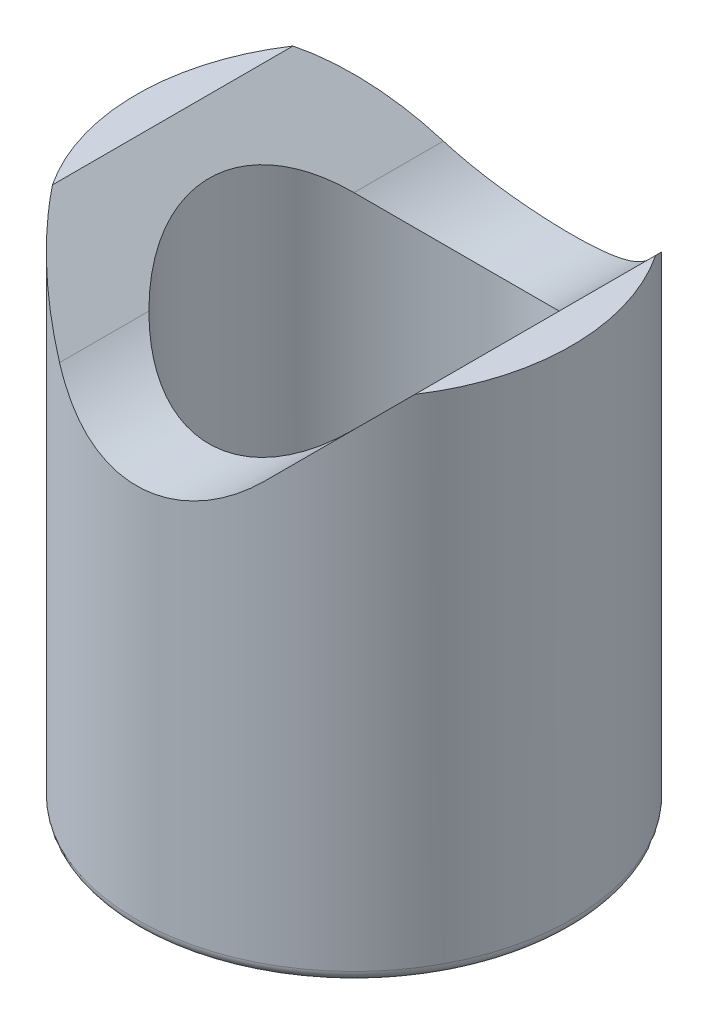
ISO-10303-21;
HEADER;
FILE_DESCRIPTION(('STEP AP214'),'2;1');
FILE_NAME('part.step','',(''),(''),'','','');
FILE_SCHEMA(('AUTOMOTIVE_DESIGN { 1 0 10303 214 1 1 1 1 }'));
ENDSEC;
DATA;
#1=APPLICATION_CONTEXT('core data for automotive mechanical design processes');
#2=APPLICATION_PROTOCOL_DEFINITION('international standard','automotive_design',2000,#1);
#3=PRODUCT_CONTEXT('',#1,'mechanical');
#4=PRODUCT('Part','Part','',(#3));
#5=PRODUCT_RELATED_PRODUCT_CATEGORY('part','',(#4));
#6=PRODUCT_DEFINITION_FORMATION('','',#4);
#7=PRODUCT_DEFINITION_CONTEXT('part definition',#1,'design');
#8=PRODUCT_DEFINITION('design','',#6,#7);
#9=PRODUCT_DEFINITION_SHAPE('','',#8);
#10=(LENGTH_UNIT() NAMED_UNIT(*) SI_UNIT(.MILLI.,.METRE.));
#11=(NAMED_UNIT(*) PLANE_ANGLE_UNIT() SI_UNIT($,.RADIAN.));
#12=(NAMED_UNIT(*) SI_UNIT($,.STERADIAN.) SOLID_ANGLE_UNIT());
#13=UNCERTAINTY_MEASURE_WITH_UNIT(LENGTH_MEASURE(1.E-05),#10,'distance_accuracy_value','');
#14=(GEOMETRIC_REPRESENTATION_CONTEXT(3) GLOBAL_UNCERTAINTY_ASSIGNED_CONTEXT((#13)) GLOBAL_UNIT_ASSIGNED_CONTEXT((#10,
#11,#12)) REPRESENTATION_CONTEXT('',''));
#15=CARTESIAN_POINT('',(0.,0.,0.));
#16=DIRECTION('',(0.,0.,1.));
#17=DIRECTION('',(1.,0.,0.));
#18=AXIS2_PLACEMENT_3D('',#15,#16,#17);
#19=CARTESIAN_POINT('',(0.,15.,0.));
#20=DIRECTION('',(0.,-1.,0.));
#21=DIRECTION('',(0.,0.,-1.));
#22=AXIS2_PLACEMENT_3D('',#19,#20,#21);
#23=CYLINDRICAL_SURFACE('',#22,6.);
#24=CARTESIAN_POINT('',(0.,0.3,0.));
#25=DIRECTION('',(0.,1.,0.));
#26=DIRECTION('',(0.,0.,1.));
#27=AXIS2_PLACEMENT_3D('',#24,#25,#26);
#28=CIRCLE('',#27,6.);
#29=CARTESIAN_POINT('',(0.,0.3,6.));
#30=VERTEX_POINT('',#29);
#31=EDGE_CURVE('E44',#30,#30,#28,.T.);
#32=ORIENTED_EDGE('',*,*,#31,.T.);
#33=EDGE_LOOP('',(#32));
#34=FACE_BOUND('',#33,.T.);
#35=CARTESIAN_POINT('',(-2.82842712474622,11.8284271247462,-5.29150262212917));
#36=CARTESIAN_POINT('',(-2.75297025166694,11.7529771607806,-5.33184478983745));
#37=CARTESIAN_POINT('',(-2.67437380901403,11.6804132231097,-5.37177250970208));
#38=CARTESIAN_POINT('',(-2.51108217079393,11.5414116339634,-5.45001321405304));
#39=CARTESIAN_POINT('',(-2.42638262276536,11.474978433221,-5.48832501464365));
#40=CARTESIAN_POINT('',(-2.25051268528001,11.3482253965884,-5.56276773112512));
#41=CARTESIAN_POINT('',(-2.15929824169915,11.287955540965,-5.59887998292586));
#42=CARTESIAN_POINT('',(-1.97132395544556,11.1746245644371,-5.66779478233693));
#43=CARTESIAN_POINT('',(-1.87456522898201,11.1215619997163,-5.70059799249845));
#44=CARTESIAN_POINT('',(-1.67540977182413,11.0229291219893,-5.76228461922013));
#45=CARTESIAN_POINT('',(-1.572986232299,10.9773993904355,-5.79114666683474));
#46=CARTESIAN_POINT('',(-1.36358431649906,10.8947667003439,-5.8439963668176));
#47=CARTESIAN_POINT('',(-1.25660657912207,10.8576625643945,-5.86798470020012));
#48=CARTESIAN_POINT('',(-1.03923835932492,10.7925548124275,-5.91034693775319));
#49=CARTESIAN_POINT('',(-0.928860822696962,10.7645204576365,-5.92873979287044));
#50=CARTESIAN_POINT('',(-0.705309652051151,10.7178735372847,-5.95946809822953));
#51=CARTESIAN_POINT('',(-0.592136502227185,10.6992593520064,-5.9718045898003));
#52=CARTESIAN_POINT('',(-0.377698754130678,10.6734412860512,-5.98894805720612));
#53=CARTESIAN_POINT('',(-0.276622254512563,10.665141982266,-5.9944771329993));
#54=CARTESIAN_POINT('',(-0.0739855225647571,10.6562530727374,-6.00039986457335));
#55=CARTESIAN_POINT('',(0.0275746668704457,10.655662795626,-6.00079396755165));
#56=CARTESIAN_POINT('',(0.230379438819053,10.6622055550273,-5.99643319864387));
#57=CARTESIAN_POINT('',(0.331623878331088,10.6693416908625,-5.99167626050293));
#58=CARTESIAN_POINT('',(0.53289530451549,10.6912160751192,-5.97714183409941));
#59=CARTESIAN_POINT('',(0.632922314466163,10.70595417795,-5.96736444198712));
#60=CARTESIAN_POINT('',(0.91550946141661,10.758572343094,-5.93261396747677));
#61=CARTESIAN_POINT('',(1.09577098016184,10.8054707536942,-5.90179171896145));
#62=CARTESIAN_POINT('',(1.44532927506301,10.9225400459782,-5.8260729460599));
#63=CARTESIAN_POINT('',(1.61462080967149,10.9927219561173,-5.78116975265079));
#64=CARTESIAN_POINT('',(1.95305769285139,11.1605465664463,-5.67622399763744));
#65=CARTESIAN_POINT('',(2.12100557341202,11.2599956362366,-5.615229055356));
#66=CARTESIAN_POINT('',(2.43837241570419,11.4801238621583,-5.48486429510174));
#67=CARTESIAN_POINT('',(2.58781289813621,11.6007779580135,-5.41550439293835));
#68=CARTESIAN_POINT('',(2.76162294790297,11.7627851431444,-5.32681312932454));
#69=CARTESIAN_POINT('',(2.79533156819427,11.7953321754941,-5.30919524361678));
#70=CARTESIAN_POINT('',(2.82842712474621,11.8284271247462,-5.29150262212917));
#71=B_SPLINE_CURVE_WITH_KNOTS('',3,(#35,#36,#37,#38,#39,#40,#41,#42,#43,#44,#45,#46,#47,#48,#49,
#50,#51,#52,#53,#54,#55,#56,#57,#58,#59,#60,#61,#62,#63,#64,#65,#66,#67,#68,#69,#70),
.UNSPECIFIED.,.F.,.F.,(4,2,2,2,2,2,2,2,2,2,2,2,2,2,2,2,2,4),(0.,0.342188032694035,
0.684622561036961,1.02964427459502,1.37459676866181,1.7213510306043,2.0680568064744,
2.41357492900304,2.75903362244739,3.0633236935568,3.36758726430211,3.67197293056892,
3.97635276754632,4.54008789128773,5.10409041577597,5.71528466835375,6.32576140488792,
6.47590756738565),.UNSPECIFIED.);
#72=CARTESIAN_POINT('',(-2.82842712474622,11.8284271247462,-5.29150262212917));
#73=VERTEX_POINT('',#72);
#74=CARTESIAN_POINT('',(2.82842712474621,11.8284271247462,-5.29150262212917));
#75=VERTEX_POINT('',#74);
#76=EDGE_CURVE('E104',#73,#75,#71,.T.);
#77=ORIENTED_EDGE('',*,*,#76,.T.);
#78=CARTESIAN_POINT('',(0.,9.,0.));
#79=DIRECTION('',(0.707106781186549,-0.707106781186546,0.));
#80=DIRECTION('',(-0.707106781186546,-0.707106781186549,0.));
#81=AXIS2_PLACEMENT_3D('',#78,#79,#80);
#82=ELLIPSE('',#81,8.48528137423859,6.);
#83=CARTESIAN_POINT('',(4.99999999999998,14.,-3.31662479035544));
#84=VERTEX_POINT('',#83);
#85=EDGE_CURVE('E99',#75,#84,#82,.T.);
#86=ORIENTED_EDGE('',*,*,#85,.T.);
#87=CARTESIAN_POINT('',(0.,14.,0.));
#88=DIRECTION('',(0.,-1.,0.));
#89=DIRECTION('',(0.,0.,-1.));
#90=AXIS2_PLACEMENT_3D('',#87,#88,#89);
#91=CIRCLE('',#90,6.);
#92=CARTESIAN_POINT('',(4.99999999999998,14.,3.31662479035543));
#93=VERTEX_POINT('',#92);
#94=EDGE_CURVE('E89',#84,#93,#91,.T.);
#95=ORIENTED_EDGE('',*,*,#94,.T.);
#96=CARTESIAN_POINT('',(2.82842712474621,11.8284271247462,5.29150262212917));
#97=VERTEX_POINT('',#96);
#98=EDGE_CURVE('E100',#93,#97,#82,.T.);
#99=ORIENTED_EDGE('',*,*,#98,.T.);
#100=CARTESIAN_POINT('',(2.82842712474621,11.8284271247462,5.29150262212917));
#101=CARTESIAN_POINT('',(2.75297025166693,11.7529771607806,5.33184478983745));
#102=CARTESIAN_POINT('',(2.67437380901402,11.6804132231097,5.37177250970208));
#103=CARTESIAN_POINT('',(2.51108217079393,11.5414116339634,5.45001321405305));
#104=CARTESIAN_POINT('',(2.42638262276536,11.474978433221,5.48832501464365));
#105=CARTESIAN_POINT('',(2.25051268528,11.3482253965884,5.56276773112512));
#106=CARTESIAN_POINT('',(2.15929824169915,11.287955540965,5.59887998292586));
#107=CARTESIAN_POINT('',(1.97132395544556,11.1746245644371,5.66779478233693));
#108=CARTESIAN_POINT('',(1.874565228982,11.1215619997163,5.70059799249845));
#109=CARTESIAN_POINT('',(1.67540977182412,11.0229291219893,5.76228461922013));
#110=CARTESIAN_POINT('',(1.572986232299,10.9773993904355,5.79114666683474));
#111=CARTESIAN_POINT('',(1.36358431649905,10.8947667003439,5.8439963668176));
#112=CARTESIAN_POINT('',(1.25660657912207,10.8576625643945,5.86798470020012));
#113=CARTESIAN_POINT('',(1.03923835932491,10.7925548124275,5.9103469377532));
#114=CARTESIAN_POINT('',(0.928860822696957,10.7645204576365,5.92873979287044));
#115=CARTESIAN_POINT('',(0.705309652051146,10.7178735372847,5.95946809822953));
#116=CARTESIAN_POINT('',(0.592136502227179,10.6992593520064,5.9718045898003));
#117=CARTESIAN_POINT('',(0.377698754130672,10.6734412860512,5.98894805720612));
#118=CARTESIAN_POINT('',(0.276622254512557,10.665141982266,5.9944771329993));
#119=CARTESIAN_POINT('',(0.0739855225647509,10.6562530727374,6.00039986457335));
#120=CARTESIAN_POINT('',(-0.0275746668704519,10.655662795626,6.00079396755165));
#121=CARTESIAN_POINT('',(-0.230379438819059,10.6622055550273,5.99643319864387));
#122=CARTESIAN_POINT('',(-0.331623878331094,10.6693416908625,5.99167626050293));
#123=CARTESIAN_POINT('',(-0.532895304515496,10.6912160751192,5.97714183409941));
#124=CARTESIAN_POINT('',(-0.632922314466169,10.70595417795,5.96736444198712));
#125=CARTESIAN_POINT('',(-0.915509461416616,10.758572343094,5.93261396747677));
#126=CARTESIAN_POINT('',(-1.09577098016185,10.8054707536942,5.90179171896145));
#127=CARTESIAN_POINT('',(-1.44532927506302,10.9225400459782,5.8260729460599));
#128=CARTESIAN_POINT('',(-1.61462080967149,10.9927219561173,5.78116975265079));
#129=CARTESIAN_POINT('',(-1.95305769285139,11.1605465664463,5.67622399763744));
#130=CARTESIAN_POINT('',(-2.12100557341202,11.2599956362366,5.615229055356));
#131=CARTESIAN_POINT('',(-2.4383724157042,11.4801238621583,5.48486429510173));
#132=CARTESIAN_POINT('',(-2.58781289813622,11.6007779580135,5.41550439293835));
#133=CARTESIAN_POINT('',(-2.76162294790298,11.7627851431444,5.32681312932453));
#134=CARTESIAN_POINT('',(-2.79533156819428,11.7953321754941,5.30919524361677));
#135=CARTESIAN_POINT('',(-2.82842712474622,11.8284271247462,5.29150262212917));
#136=B_SPLINE_CURVE_WITH_KNOTS('',3,(#100,#101,#102,#103,#104,#105,#106,#107,#108,#109,#110,
#111,#112,#113,#114,#115,#116,#117,#118,#119,#120,#121,#122,#123,#124,#125,#126,#127,#128,#129,
#130,#131,#132,#133,#134,#135),.UNSPECIFIED.,.F.,.F.,(4,2,2,2,2,2,2,2,2,2,2,2,2,2,2,2,2,4),(0.,
0.342188032694035,0.684622561036961,1.02964427459502,1.37459676866181,1.7213510306043,
2.0680568064744,2.41357492900305,2.75903362244739,3.06332369355681,3.36758726430211,
3.67197293056892,3.97635276754633,4.54008789128773,5.10409041577598,5.71528466835375,
6.32576140488793,6.47590756738565),.UNSPECIFIED.);
#137=CARTESIAN_POINT('',(-2.82842712474622,11.8284271247462,5.29150262212917));
#138=VERTEX_POINT('',#137);
#139=EDGE_CURVE('E118',#97,#138,#136,.T.);
#140=ORIENTED_EDGE('',*,*,#139,.T.);
#141=CARTESIAN_POINT('',(0.,9.,0.));
#142=DIRECTION('',(-0.707106781186549,-0.707106781186546,0.));
#143=DIRECTION('',(0.707106781186546,-0.707106781186549,0.));
#144=AXIS2_PLACEMENT_3D('',#141,#142,#143);
#145=ELLIPSE('',#144,8.48528137423859,6.);
#146=CARTESIAN_POINT('',(-4.99999999999998,14.,3.31662479035543));
#147=VERTEX_POINT('',#146);
#148=EDGE_CURVE('E107',#138,#147,#145,.T.);
#149=ORIENTED_EDGE('',*,*,#148,.T.);
#150=CARTESIAN_POINT('',(0.,14.,0.));
#151=DIRECTION('',(0.,-1.,0.));
#152=DIRECTION('',(1.,0.,0.));
#153=AXIS2_PLACEMENT_3D('',#150,#151,#152);
#154=CIRCLE('',#153,6.);
#155=CARTESIAN_POINT('',(-4.99999999999998,14.,-3.31662479035543));
#156=VERTEX_POINT('',#155);
#157=EDGE_CURVE('E96',#147,#156,#154,.T.);
#158=ORIENTED_EDGE('',*,*,#157,.T.);
#159=EDGE_CURVE('E105',#156,#73,#145,.T.);
#160=ORIENTED_EDGE('',*,*,#159,.T.);
#161=EDGE_LOOP('',(#77,#86,#95,#99,#140,#149,#158,#160));
#162=FACE_BOUND('',#161,.T.);
#163=ADVANCED_FACE('F36',(#34,#162),#23,.T.);
#164=CARTESIAN_POINT('',(0.,0.,0.));
#165=DIRECTION('',(0.,1.,0.));
#166=DIRECTION('',(0.,0.,1.));
#167=AXIS2_PLACEMENT_3D('',#164,#165,#166);
#168=PLANE('',#167);
#169=CARTESIAN_POINT('',(0.,0.,0.));
#170=DIRECTION('',(0.,1.,0.));
#171=DIRECTION('',(0.,0.,1.));
#172=AXIS2_PLACEMENT_3D('',#169,#170,#171);
#173=CIRCLE('',#172,5.7);
#174=CARTESIAN_POINT('',(0.,0.,5.7));
#175=VERTEX_POINT('',#174);
#176=EDGE_CURVE('E11',#175,#175,#173,.F.);
#177=ORIENTED_EDGE('',*,*,#176,.T.);
#178=EDGE_LOOP('',(#177));
#179=FACE_BOUND('',#178,.T.);
#180=CARTESIAN_POINT('',(0.,0.,0.));
#181=DIRECTION('',(0.,1.,0.));
#182=DIRECTION('',(0.,0.,1.));
#183=AXIS2_PLACEMENT_3D('',#180,#181,#182);
#184=CIRCLE('',#183,4.);
#185=CARTESIAN_POINT('',(0.,0.,4.));
#186=VERTEX_POINT('',#185);
#187=EDGE_CURVE('E150',#186,#186,#184,.T.);
#188=ORIENTED_EDGE('',*,*,#187,.T.);
#189=EDGE_LOOP('',(#188));
#190=FACE_BOUND('',#189,.T.);
#191=ADVANCED_FACE('F138',(#179,#190),#168,.F.);
#192=CARTESIAN_POINT('',(0.,15.,0.));
#193=DIRECTION('',(0.,-1.,0.));
#194=DIRECTION('',(0.,0.,-1.));
#195=AXIS2_PLACEMENT_3D('',#192,#193,#194);
#196=CYLINDRICAL_SURFACE('',#195,4.);
#197=CARTESIAN_POINT('',(0.,9.,0.));
#198=DIRECTION('',(-0.707106781186549,-0.707106781186546,0.));
#199=DIRECTION('',(0.707106781186546,-0.707106781186549,0.));
#200=AXIS2_PLACEMENT_3D('',#197,#198,#199);
#201=ELLIPSE('',#200,5.65685424949239,4.);
#202=CARTESIAN_POINT('',(-2.82842712474622,11.8284271247462,2.82842712474616));
#203=VERTEX_POINT('',#202);
#204=CARTESIAN_POINT('',(-2.82842712474622,11.8284271247462,-2.82842712474617));
#205=VERTEX_POINT('',#204);
#206=EDGE_CURVE('E159',#203,#205,#201,.T.);
#207=ORIENTED_EDGE('',*,*,#206,.F.);
#208=CARTESIAN_POINT('',(0.,14.6568542494924,0.));
#209=DIRECTION('',(0.,-0.707106781186548,-0.707106781186547));
#210=DIRECTION('',(0.,-0.707106781186548,0.707106781186547));
#211=AXIS2_PLACEMENT_3D('',#208,#209,#210);
#212=ELLIPSE('',#211,5.65685424949238,4.);
#213=CARTESIAN_POINT('',(2.82842712474621,11.8284271247462,2.82842712474616));
#214=VERTEX_POINT('',#213);
#215=EDGE_CURVE('E153',#214,#203,#212,.T.);
#216=ORIENTED_EDGE('',*,*,#215,.F.);
#217=CARTESIAN_POINT('',(0.,9.,0.));
#218=DIRECTION('',(0.707106781186549,-0.707106781186546,0.));
#219=DIRECTION('',(-0.707106781186546,-0.707106781186549,0.));
#220=AXIS2_PLACEMENT_3D('',#217,#218,#219);
#221=ELLIPSE('',#220,5.65685424949239,4.);
#222=CARTESIAN_POINT('',(2.82842712474621,11.8284271247462,-2.82842712474617));
#223=VERTEX_POINT('',#222);
#224=EDGE_CURVE('E152',#223,#214,#221,.T.);
#225=ORIENTED_EDGE('',*,*,#224,.F.);
#226=CARTESIAN_POINT('',(0.,14.6568542494924,0.));
#227=DIRECTION('',(0.,-0.707106781186548,0.707106781186547));
#228=DIRECTION('',(0.,-0.707106781186548,-0.707106781186547));
#229=AXIS2_PLACEMENT_3D('',#226,#227,#228);
#230=ELLIPSE('',#229,5.65685424949238,4.);
#231=EDGE_CURVE('E157',#205,#223,#230,.T.);
#232=ORIENTED_EDGE('',*,*,#231,.F.);
#233=EDGE_LOOP('',(#207,#216,#225,#232));
#234=FACE_BOUND('',#233,.T.);
#235=ORIENTED_EDGE('',*,*,#187,.F.);
#236=EDGE_LOOP('',(#235));
#237=FACE_BOUND('',#236,.T.);
#238=ADVANCED_FACE('F134',(#234,#237),#196,.F.);
#239=CARTESIAN_POINT('',(-4.99999999999998,14.,-6.));
#240=DIRECTION('',(0.,-1.,0.));
#241=DIRECTION('',(1.,0.,0.));
#242=AXIS2_PLACEMENT_3D('',#239,#240,#241);
#243=PLANE('',#242);
#244=DIRECTION('',(0.,0.,1.));
#245=VECTOR('',#244,1.);
#246=CARTESIAN_POINT('',(-4.99999999999998,14.,-6.));
#247=LINE('',#246,#245);
#248=EDGE_CURVE('E101',#156,#147,#247,.T.);
#249=ORIENTED_EDGE('',*,*,#248,.F.);
#250=ORIENTED_EDGE('',*,*,#157,.F.);
#251=EDGE_LOOP('',(#249,#250));
#252=FACE_BOUND('',#251,.T.);
#253=ADVANCED_FACE('F137',(#252),#243,.F.);
#254=CARTESIAN_POINT('',(4.99999999999998,14.,-6.));
#255=DIRECTION('',(0.,-1.,0.));
#256=DIRECTION('',(0.,0.,-1.));
#257=AXIS2_PLACEMENT_3D('',#254,#255,#256);
#258=PLANE('',#257);
#259=DIRECTION('',(0.,0.,1.));
#260=VECTOR('',#259,1.);
#261=CARTESIAN_POINT('',(4.99999999999998,14.,-6.));
#262=LINE('',#261,#260);
#263=EDGE_CURVE('E92',#84,#93,#262,.T.);
#264=ORIENTED_EDGE('',*,*,#263,.T.);
#265=ORIENTED_EDGE('',*,*,#94,.F.);
#266=EDGE_LOOP('',(#264,#265));
#267=FACE_BOUND('',#266,.T.);
#268=ADVANCED_FACE('F91',(#267),#258,.F.);
#269=CARTESIAN_POINT('',(0.,14.6568542494924,-6.));
#270=DIRECTION('',(0.,0.,1.));
#271=DIRECTION('',(1.,0.,0.));
#272=AXIS2_PLACEMENT_3D('',#269,#270,#271);
#273=CYLINDRICAL_SURFACE('',#272,4.);
#274=DIRECTION('',(0.,0.,1.));
#275=VECTOR('',#274,1.);
#276=CARTESIAN_POINT('',(2.82842712474621,11.8284271247462,-6.));
#277=LINE('',#276,#275);
#278=EDGE_CURVE('E51',#214,#97,#277,.T.);
#279=ORIENTED_EDGE('',*,*,#278,.F.);
#280=ORIENTED_EDGE('',*,*,#215,.T.);
#281=DIRECTION('',(0.,0.,1.));
#282=VECTOR('',#281,1.);
#283=CARTESIAN_POINT('',(-2.82842712474622,11.8284271247462,-6.));
#284=LINE('',#283,#282);
#285=EDGE_CURVE('E243',#203,#138,#284,.T.);
#286=ORIENTED_EDGE('',*,*,#285,.T.);
#287=ORIENTED_EDGE('',*,*,#139,.F.);
#288=EDGE_LOOP('',(#279,#280,#286,#287));
#289=FACE_BOUND('',#288,.T.);
#290=ADVANCED_FACE('F126',(#289),#273,.F.);
#291=EDGE_CURVE('E109',#73,#205,#284,.T.);
#292=ORIENTED_EDGE('',*,*,#291,.T.);
#293=ORIENTED_EDGE('',*,*,#231,.T.);
#294=EDGE_CURVE('E57',#75,#223,#277,.T.);
#295=ORIENTED_EDGE('',*,*,#294,.F.);
#296=ORIENTED_EDGE('',*,*,#76,.F.);
#297=EDGE_LOOP('',(#292,#293,#295,#296));
#298=FACE_BOUND('',#297,.T.);
#299=ADVANCED_FACE('F131',(#298),#273,.F.);
#300=CARTESIAN_POINT('',(-2.82842712474622,11.8284271247462,-6.));
#301=DIRECTION('',(-0.707106781186549,-0.707106781186546,0.));
#302=DIRECTION('',(0.707106781186546,-0.707106781186549,0.));
#303=AXIS2_PLACEMENT_3D('',#300,#301,#302);
#304=PLANE('',#303);
#305=ORIENTED_EDGE('',*,*,#285,.F.);
#306=ORIENTED_EDGE('',*,*,#206,.T.);
#307=ORIENTED_EDGE('',*,*,#291,.F.);
#308=ORIENTED_EDGE('',*,*,#159,.F.);
#309=ORIENTED_EDGE('',*,*,#248,.T.);
#310=ORIENTED_EDGE('',*,*,#148,.F.);
#311=EDGE_LOOP('',(#305,#306,#307,#308,#309,#310));
#312=FACE_BOUND('',#311,.T.);
#313=ADVANCED_FACE('F170',(#312),#304,.F.);
#314=CARTESIAN_POINT('',(4.99999999999998,14.,-6.));
#315=DIRECTION('',(0.707106781186549,-0.707106781186546,0.));
#316=DIRECTION('',(0.707106781186546,0.707106781186549,0.));
#317=AXIS2_PLACEMENT_3D('',#314,#315,#316);
#318=PLANE('',#317);
#319=ORIENTED_EDGE('',*,*,#294,.T.);
#320=ORIENTED_EDGE('',*,*,#224,.T.);
#321=ORIENTED_EDGE('',*,*,#278,.T.);
#322=ORIENTED_EDGE('',*,*,#98,.F.);
#323=ORIENTED_EDGE('',*,*,#263,.F.);
#324=ORIENTED_EDGE('',*,*,#85,.F.);
#325=EDGE_LOOP('',(#319,#320,#321,#322,#323,#324));
#326=FACE_BOUND('',#325,.T.);
#327=ADVANCED_FACE('F98',(#326),#318,.F.);
#328=CARTESIAN_POINT('',(0.,0.3,0.));
#329=DIRECTION('',(0.,1.,0.));
#330=DIRECTION('',(0.,0.,1.));
#331=AXIS2_PLACEMENT_3D('',#328,#329,#330);
#332=TOROIDAL_SURFACE('',#331,5.7,0.3);
#333=ORIENTED_EDGE('',*,*,#176,.F.);
#334=EDGE_LOOP('',(#333));
#335=FACE_BOUND('',#334,.T.);
#336=ORIENTED_EDGE('',*,*,#31,.F.);
#337=EDGE_LOOP('',(#336));
#338=FACE_BOUND('',#337,.T.);
#339=ADVANCED_FACE('F38',(#335,#338),#332,.T.);
#340=CLOSED_SHELL('',(#163,#191,#238,#253,#268,#290,#299,#313,#327,#339));
#341=MANIFOLD_SOLID_BREP('B2',#340);
#342=ADVANCED_BREP_SHAPE_REPRESENTATION('',(#18,#341),#14);
#343=SHAPE_DEFINITION_REPRESENTATION(#9,#342);
ENDSEC;
END-ISO-10303-21;
